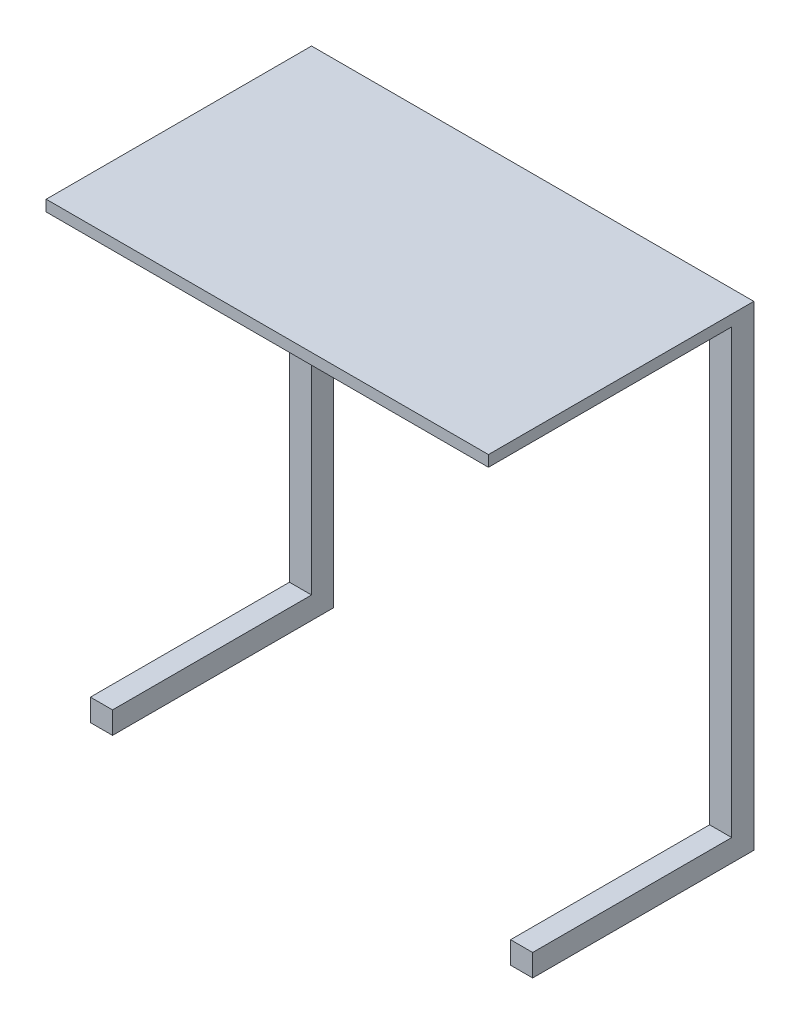
ISO-10303-21;
HEADER;
FILE_DESCRIPTION(('STEP AP214'),'2;1');
FILE_NAME('part.step','',(''),(''),'','','');
FILE_SCHEMA(('AUTOMOTIVE_DESIGN { 1 0 10303 214 1 1 1 1 }'));
ENDSEC;
DATA;
#1=APPLICATION_CONTEXT('core data for automotive mechanical design processes');
#2=APPLICATION_PROTOCOL_DEFINITION('international standard','automotive_design',2000,#1);
#3=PRODUCT_CONTEXT('',#1,'mechanical');
#4=PRODUCT('Part','Part','',(#3));
#5=PRODUCT_RELATED_PRODUCT_CATEGORY('part','',(#4));
#6=PRODUCT_DEFINITION_FORMATION('','',#4);
#7=PRODUCT_DEFINITION_CONTEXT('part definition',#1,'design');
#8=PRODUCT_DEFINITION('design','',#6,#7);
#9=PRODUCT_DEFINITION_SHAPE('','',#8);
#10=(LENGTH_UNIT() NAMED_UNIT(*) SI_UNIT(.MILLI.,.METRE.));
#11=(NAMED_UNIT(*) PLANE_ANGLE_UNIT() SI_UNIT($,.RADIAN.));
#12=(NAMED_UNIT(*) SI_UNIT($,.STERADIAN.) SOLID_ANGLE_UNIT());
#13=UNCERTAINTY_MEASURE_WITH_UNIT(LENGTH_MEASURE(1.E-05),#10,'distance_accuracy_value','');
#14=(GEOMETRIC_REPRESENTATION_CONTEXT(3) GLOBAL_UNCERTAINTY_ASSIGNED_CONTEXT((#13)) GLOBAL_UNIT_ASSIGNED_CONTEXT((#10,
#11,#12)) REPRESENTATION_CONTEXT('',''));
#15=CARTESIAN_POINT('',(0.,0.,0.));
#16=DIRECTION('',(0.,0.,1.));
#17=DIRECTION('',(1.,0.,0.));
#18=AXIS2_PLACEMENT_3D('',#15,#16,#17);
#19=CARTESIAN_POINT('',(508.,25.4,-304.8));
#20=DIRECTION('',(-1.,0.,0.));
#21=DIRECTION('',(0.,0.,1.));
#22=AXIS2_PLACEMENT_3D('',#19,#20,#21);
#23=PLANE('',#22);
#24=DIRECTION('',(0.,0.,-1.));
#25=VECTOR('',#24,1.);
#26=CARTESIAN_POINT('',(508.,0.,-304.8));
#27=LINE('',#26,#25);
#28=CARTESIAN_POINT('',(508.,0.,304.8));
#29=VERTEX_POINT('',#28);
#30=CARTESIAN_POINT('',(508.,0.,-254.));
#31=VERTEX_POINT('',#30);
#32=EDGE_CURVE('E209',#29,#31,#27,.T.);
#33=ORIENTED_EDGE('',*,*,#32,.T.);
#34=DIRECTION('',(0.,1.,0.));
#35=VECTOR('',#34,1.);
#36=CARTESIAN_POINT('',(508.,-1016.,-254.));
#37=LINE('',#36,#35);
#38=CARTESIAN_POINT('',(508.,-1016.,-254.));
#39=VERTEX_POINT('',#38);
#40=EDGE_CURVE('E192',#39,#31,#37,.T.);
#41=ORIENTED_EDGE('',*,*,#40,.F.);
#42=DIRECTION('',(0.,0.,1.));
#43=VECTOR('',#42,1.);
#44=CARTESIAN_POINT('',(508.,-1016.,-304.8));
#45=LINE('',#44,#43);
#46=CARTESIAN_POINT('',(508.,-1016.,203.2));
#47=VERTEX_POINT('',#46);
#48=EDGE_CURVE('E155',#39,#47,#45,.T.);
#49=ORIENTED_EDGE('',*,*,#48,.T.);
#50=DIRECTION('',(0.,1.,0.));
#51=VECTOR('',#50,1.);
#52=CARTESIAN_POINT('',(508.,-1066.8,203.2));
#53=LINE('',#52,#51);
#54=CARTESIAN_POINT('',(508.,-1066.8,203.2));
#55=VERTEX_POINT('',#54);
#56=EDGE_CURVE('E135',#55,#47,#53,.T.);
#57=ORIENTED_EDGE('',*,*,#56,.F.);
#58=DIRECTION('',(0.,0.,1.));
#59=VECTOR('',#58,1.);
#60=CARTESIAN_POINT('',(508.,-1066.8,-304.8));
#61=LINE('',#60,#59);
#62=CARTESIAN_POINT('',(508.,-1066.8,-304.8));
#63=VERTEX_POINT('',#62);
#64=EDGE_CURVE('E142',#63,#55,#61,.T.);
#65=ORIENTED_EDGE('',*,*,#64,.F.);
#66=DIRECTION('',(0.,-1.,0.));
#67=VECTOR('',#66,1.);
#68=CARTESIAN_POINT('',(508.,25.4,-304.8));
#69=LINE('',#68,#67);
#70=CARTESIAN_POINT('',(508.,25.4,-304.8));
#71=VERTEX_POINT('',#70);
#72=EDGE_CURVE('E11',#71,#63,#69,.T.);
#73=ORIENTED_EDGE('',*,*,#72,.F.);
#74=DIRECTION('',(0.,0.,-1.));
#75=VECTOR('',#74,1.);
#76=CARTESIAN_POINT('',(508.,25.4,-304.8));
#77=LINE('',#76,#75);
#78=CARTESIAN_POINT('',(508.,25.4,304.8));
#79=VERTEX_POINT('',#78);
#80=EDGE_CURVE('E213',#79,#71,#77,.T.);
#81=ORIENTED_EDGE('',*,*,#80,.F.);
#82=DIRECTION('',(0.,-1.,0.));
#83=VECTOR('',#82,1.);
#84=CARTESIAN_POINT('',(508.,25.4,304.8));
#85=LINE('',#84,#83);
#86=EDGE_CURVE('E223',#79,#29,#85,.T.);
#87=ORIENTED_EDGE('',*,*,#86,.T.);
#88=EDGE_LOOP('',(#33,#41,#49,#57,#65,#73,#81,#87));
#89=FACE_BOUND('',#88,.T.);
#90=ADVANCED_FACE('F32',(#89),#23,.F.);
#91=CARTESIAN_POINT('',(-508.,25.4,-304.8));
#92=DIRECTION('',(0.,0.,1.));
#93=DIRECTION('',(1.,0.,0.));
#94=AXIS2_PLACEMENT_3D('',#91,#92,#93);
#95=PLANE('',#94);
#96=ORIENTED_EDGE('',*,*,#72,.T.);
#97=DIRECTION('',(1.,0.,0.));
#98=VECTOR('',#97,1.);
#99=CARTESIAN_POINT('',(508.,-1066.8,-304.8));
#100=LINE('',#99,#98);
#101=CARTESIAN_POINT('',(457.2,-1066.8,-304.8));
#102=VERTEX_POINT('',#101);
#103=EDGE_CURVE('E148',#102,#63,#100,.T.);
#104=ORIENTED_EDGE('',*,*,#103,.F.);
#105=DIRECTION('',(0.,1.,0.));
#106=VECTOR('',#105,1.);
#107=CARTESIAN_POINT('',(457.2,-1016.,-304.8));
#108=LINE('',#107,#106);
#109=CARTESIAN_POINT('',(457.2,0.,-304.8));
#110=VERTEX_POINT('',#109);
#111=EDGE_CURVE('E187',#102,#110,#108,.T.);
#112=ORIENTED_EDGE('',*,*,#111,.T.);
#113=DIRECTION('',(-1.,0.,0.));
#114=VECTOR('',#113,1.);
#115=CARTESIAN_POINT('',(-508.,0.,-304.8));
#116=LINE('',#115,#114);
#117=CARTESIAN_POINT('',(-457.2,0.,-304.8));
#118=VERTEX_POINT('',#117);
#119=EDGE_CURVE('E53',#110,#118,#116,.T.);
#120=ORIENTED_EDGE('',*,*,#119,.T.);
#121=DIRECTION('',(0.,1.,0.));
#122=VECTOR('',#121,1.);
#123=CARTESIAN_POINT('',(-457.2,-1016.,-304.8));
#124=LINE('',#123,#122);
#125=CARTESIAN_POINT('',(-457.2,-1066.8,-304.8));
#126=VERTEX_POINT('',#125);
#127=EDGE_CURVE('E207',#126,#118,#124,.T.);
#128=ORIENTED_EDGE('',*,*,#127,.F.);
#129=DIRECTION('',(1.,0.,0.));
#130=VECTOR('',#129,1.);
#131=CARTESIAN_POINT('',(-508.,-1066.8,-304.8));
#132=LINE('',#131,#130);
#133=CARTESIAN_POINT('',(-508.,-1066.8,-304.8));
#134=VERTEX_POINT('',#133);
#135=EDGE_CURVE('E168',#134,#126,#132,.T.);
#136=ORIENTED_EDGE('',*,*,#135,.F.);
#137=DIRECTION('',(0.,-1.,0.));
#138=VECTOR('',#137,1.);
#139=CARTESIAN_POINT('',(-508.,25.4,-304.8));
#140=LINE('',#139,#138);
#141=CARTESIAN_POINT('',(-508.,25.4,-304.8));
#142=VERTEX_POINT('',#141);
#143=EDGE_CURVE('E39',#142,#134,#140,.T.);
#144=ORIENTED_EDGE('',*,*,#143,.F.);
#145=DIRECTION('',(-1.,0.,0.));
#146=VECTOR('',#145,1.);
#147=CARTESIAN_POINT('',(-508.,25.4,-304.8));
#148=LINE('',#147,#146);
#149=EDGE_CURVE('E216',#71,#142,#148,.T.);
#150=ORIENTED_EDGE('',*,*,#149,.F.);
#151=EDGE_LOOP('',(#96,#104,#112,#120,#128,#136,#144,#150));
#152=FACE_BOUND('',#151,.T.);
#153=ADVANCED_FACE('F240',(#152),#95,.F.);
#154=CARTESIAN_POINT('',(-508.,25.4,-304.8));
#155=DIRECTION('',(1.,0.,0.));
#156=DIRECTION('',(0.,0.,-1.));
#157=AXIS2_PLACEMENT_3D('',#154,#155,#156);
#158=PLANE('',#157);
#159=ORIENTED_EDGE('',*,*,#143,.T.);
#160=DIRECTION('',(0.,0.,-1.));
#161=VECTOR('',#160,1.);
#162=CARTESIAN_POINT('',(-508.,-1066.8,-304.8));
#163=LINE('',#162,#161);
#164=CARTESIAN_POINT('',(-508.,-1066.8,203.2));
#165=VERTEX_POINT('',#164);
#166=EDGE_CURVE('E165',#165,#134,#163,.T.);
#167=ORIENTED_EDGE('',*,*,#166,.F.);
#168=DIRECTION('',(0.,1.,0.));
#169=VECTOR('',#168,1.);
#170=CARTESIAN_POINT('',(-508.,-1066.8,203.2));
#171=LINE('',#170,#169);
#172=CARTESIAN_POINT('',(-508.,-1016.,203.2));
#173=VERTEX_POINT('',#172);
#174=EDGE_CURVE('E175',#165,#173,#171,.T.);
#175=ORIENTED_EDGE('',*,*,#174,.T.);
#176=DIRECTION('',(0.,0.,-1.));
#177=VECTOR('',#176,1.);
#178=CARTESIAN_POINT('',(-508.,-1016.,-304.8));
#179=LINE('',#178,#177);
#180=CARTESIAN_POINT('',(-508.,-1016.,-254.));
#181=VERTEX_POINT('',#180);
#182=EDGE_CURVE('E157',#173,#181,#179,.T.);
#183=ORIENTED_EDGE('',*,*,#182,.T.);
#184=DIRECTION('',(0.,1.,0.));
#185=VECTOR('',#184,1.);
#186=CARTESIAN_POINT('',(-508.,-1016.,-254.));
#187=LINE('',#186,#185);
#188=CARTESIAN_POINT('',(-508.,0.,-254.));
#189=VERTEX_POINT('',#188);
#190=EDGE_CURVE('E201',#181,#189,#187,.T.);
#191=ORIENTED_EDGE('',*,*,#190,.T.);
#192=DIRECTION('',(0.,0.,1.));
#193=VECTOR('',#192,1.);
#194=CARTESIAN_POINT('',(-508.,0.,-304.8));
#195=LINE('',#194,#193);
#196=CARTESIAN_POINT('',(-508.,0.,304.8));
#197=VERTEX_POINT('',#196);
#198=EDGE_CURVE('E226',#189,#197,#195,.T.);
#199=ORIENTED_EDGE('',*,*,#198,.T.);
#200=DIRECTION('',(0.,-1.,0.));
#201=VECTOR('',#200,1.);
#202=CARTESIAN_POINT('',(-508.,25.4,304.8));
#203=LINE('',#202,#201);
#204=CARTESIAN_POINT('',(-508.,25.4,304.8));
#205=VERTEX_POINT('',#204);
#206=EDGE_CURVE('E231',#205,#197,#203,.T.);
#207=ORIENTED_EDGE('',*,*,#206,.F.);
#208=DIRECTION('',(0.,0.,1.));
#209=VECTOR('',#208,1.);
#210=CARTESIAN_POINT('',(-508.,25.4,-304.8));
#211=LINE('',#210,#209);
#212=EDGE_CURVE('E219',#142,#205,#211,.T.);
#213=ORIENTED_EDGE('',*,*,#212,.F.);
#214=EDGE_LOOP('',(#159,#167,#175,#183,#191,#199,#207,#213));
#215=FACE_BOUND('',#214,.T.);
#216=ADVANCED_FACE('F238',(#215),#158,.F.);
#217=CARTESIAN_POINT('',(-508.,25.4,304.8));
#218=DIRECTION('',(0.,0.,-1.));
#219=DIRECTION('',(-1.,0.,0.));
#220=AXIS2_PLACEMENT_3D('',#217,#218,#219);
#221=PLANE('',#220);
#222=DIRECTION('',(1.,0.,0.));
#223=VECTOR('',#222,1.);
#224=CARTESIAN_POINT('',(-508.,0.,304.8));
#225=LINE('',#224,#223);
#226=EDGE_CURVE('E217',#197,#29,#225,.T.);
#227=ORIENTED_EDGE('',*,*,#226,.T.);
#228=ORIENTED_EDGE('',*,*,#86,.F.);
#229=DIRECTION('',(1.,0.,0.));
#230=VECTOR('',#229,1.);
#231=CARTESIAN_POINT('',(-508.,25.4,304.8));
#232=LINE('',#231,#230);
#233=EDGE_CURVE('E221',#205,#79,#232,.T.);
#234=ORIENTED_EDGE('',*,*,#233,.F.);
#235=ORIENTED_EDGE('',*,*,#206,.T.);
#236=EDGE_LOOP('',(#227,#228,#234,#235));
#237=FACE_BOUND('',#236,.T.);
#238=ADVANCED_FACE('F264',(#237),#221,.F.);
#239=CARTESIAN_POINT('',(0.,25.4,0.));
#240=DIRECTION('',(0.,1.,0.));
#241=DIRECTION('',(0.,0.,1.));
#242=AXIS2_PLACEMENT_3D('',#239,#240,#241);
#243=PLANE('',#242);
#244=ORIENTED_EDGE('',*,*,#80,.T.);
#245=ORIENTED_EDGE('',*,*,#149,.T.);
#246=ORIENTED_EDGE('',*,*,#212,.T.);
#247=ORIENTED_EDGE('',*,*,#233,.T.);
#248=EDGE_LOOP('',(#244,#245,#246,#247));
#249=FACE_BOUND('',#248,.T.);
#250=ADVANCED_FACE('F271',(#249),#243,.T.);
#251=CARTESIAN_POINT('',(0.,0.,0.));
#252=DIRECTION('',(0.,1.,0.));
#253=DIRECTION('',(0.,0.,1.));
#254=AXIS2_PLACEMENT_3D('',#251,#252,#253);
#255=PLANE('',#254);
#256=DIRECTION('',(0.,0.,1.));
#257=VECTOR('',#256,1.);
#258=CARTESIAN_POINT('',(457.2,0.,-304.8));
#259=LINE('',#258,#257);
#260=CARTESIAN_POINT('',(457.2,0.,-254.));
#261=VERTEX_POINT('',#260);
#262=EDGE_CURVE('E46',#110,#261,#259,.T.);
#263=ORIENTED_EDGE('',*,*,#262,.T.);
#264=DIRECTION('',(1.,0.,0.));
#265=VECTOR('',#264,1.);
#266=CARTESIAN_POINT('',(508.,0.,-254.));
#267=LINE('',#266,#265);
#268=EDGE_CURVE('E188',#261,#31,#267,.T.);
#269=ORIENTED_EDGE('',*,*,#268,.T.);
#270=ORIENTED_EDGE('',*,*,#32,.F.);
#271=ORIENTED_EDGE('',*,*,#226,.F.);
#272=ORIENTED_EDGE('',*,*,#198,.F.);
#273=DIRECTION('',(1.,0.,0.));
#274=VECTOR('',#273,1.);
#275=CARTESIAN_POINT('',(-508.,0.,-254.));
#276=LINE('',#275,#274);
#277=CARTESIAN_POINT('',(-457.2,0.,-254.));
#278=VERTEX_POINT('',#277);
#279=EDGE_CURVE('E194',#189,#278,#276,.T.);
#280=ORIENTED_EDGE('',*,*,#279,.T.);
#281=DIRECTION('',(0.,0.,-1.));
#282=VECTOR('',#281,1.);
#283=CARTESIAN_POINT('',(-457.2,0.,-304.8));
#284=LINE('',#283,#282);
#285=EDGE_CURVE('E202',#278,#118,#284,.T.);
#286=ORIENTED_EDGE('',*,*,#285,.T.);
#287=ORIENTED_EDGE('',*,*,#119,.F.);
#288=EDGE_LOOP('',(#263,#269,#270,#271,#272,#280,#286,#287));
#289=FACE_BOUND('',#288,.T.);
#290=ADVANCED_FACE('F267',(#289),#255,.F.);
#291=CARTESIAN_POINT('',(-457.2,-1016.,-304.8));
#292=DIRECTION('',(1.,0.,0.));
#293=DIRECTION('',(0.,0.,-1.));
#294=AXIS2_PLACEMENT_3D('',#291,#292,#293);
#295=PLANE('',#294);
#296=ORIENTED_EDGE('',*,*,#285,.F.);
#297=DIRECTION('',(0.,1.,0.));
#298=VECTOR('',#297,1.);
#299=CARTESIAN_POINT('',(-457.2,-1016.,-254.));
#300=LINE('',#299,#298);
#301=CARTESIAN_POINT('',(-457.2,-1016.,-254.));
#302=VERTEX_POINT('',#301);
#303=EDGE_CURVE('E210',#302,#278,#300,.T.);
#304=ORIENTED_EDGE('',*,*,#303,.F.);
#305=DIRECTION('',(0.,0.,1.));
#306=VECTOR('',#305,1.);
#307=CARTESIAN_POINT('',(-457.2,-1016.,-304.8));
#308=LINE('',#307,#306);
#309=CARTESIAN_POINT('',(-457.2,-1016.,203.2));
#310=VERTEX_POINT('',#309);
#311=EDGE_CURVE('E160',#302,#310,#308,.T.);
#312=ORIENTED_EDGE('',*,*,#311,.T.);
#313=DIRECTION('',(0.,1.,0.));
#314=VECTOR('',#313,1.);
#315=CARTESIAN_POINT('',(-457.2,-1066.8,203.2));
#316=LINE('',#315,#314);
#317=CARTESIAN_POINT('',(-457.2,-1066.8,203.2));
#318=VERTEX_POINT('',#317);
#319=EDGE_CURVE('E181',#318,#310,#316,.T.);
#320=ORIENTED_EDGE('',*,*,#319,.F.);
#321=DIRECTION('',(0.,0.,1.));
#322=VECTOR('',#321,1.);
#323=CARTESIAN_POINT('',(-457.2,-1066.8,-304.8));
#324=LINE('',#323,#322);
#325=EDGE_CURVE('E172',#126,#318,#324,.T.);
#326=ORIENTED_EDGE('',*,*,#325,.F.);
#327=ORIENTED_EDGE('',*,*,#127,.T.);
#328=EDGE_LOOP('',(#296,#304,#312,#320,#326,#327));
#329=FACE_BOUND('',#328,.T.);
#330=ADVANCED_FACE('F285',(#329),#295,.T.);
#331=CARTESIAN_POINT('',(-508.,-1016.,-254.));
#332=DIRECTION('',(0.,0.,1.));
#333=DIRECTION('',(1.,0.,0.));
#334=AXIS2_PLACEMENT_3D('',#331,#332,#333);
#335=PLANE('',#334);
#336=ORIENTED_EDGE('',*,*,#279,.F.);
#337=ORIENTED_EDGE('',*,*,#190,.F.);
#338=DIRECTION('',(1.,0.,0.));
#339=VECTOR('',#338,1.);
#340=CARTESIAN_POINT('',(-508.,-1016.,-254.));
#341=LINE('',#340,#339);
#342=EDGE_CURVE('E198',#181,#302,#341,.T.);
#343=ORIENTED_EDGE('',*,*,#342,.T.);
#344=ORIENTED_EDGE('',*,*,#303,.T.);
#345=EDGE_LOOP('',(#336,#337,#343,#344));
#346=FACE_BOUND('',#345,.T.);
#347=ADVANCED_FACE('F257',(#346),#335,.T.);
#348=CARTESIAN_POINT('',(508.,-1016.,-254.));
#349=DIRECTION('',(0.,0.,1.));
#350=DIRECTION('',(1.,0.,0.));
#351=AXIS2_PLACEMENT_3D('',#348,#349,#350);
#352=PLANE('',#351);
#353=ORIENTED_EDGE('',*,*,#268,.F.);
#354=DIRECTION('',(0.,1.,0.));
#355=VECTOR('',#354,1.);
#356=CARTESIAN_POINT('',(457.2,-1016.,-254.));
#357=LINE('',#356,#355);
#358=CARTESIAN_POINT('',(457.2,-1016.,-254.));
#359=VERTEX_POINT('',#358);
#360=EDGE_CURVE('E195',#359,#261,#357,.T.);
#361=ORIENTED_EDGE('',*,*,#360,.F.);
#362=DIRECTION('',(1.,0.,0.));
#363=VECTOR('',#362,1.);
#364=CARTESIAN_POINT('',(508.,-1016.,-254.));
#365=LINE('',#364,#363);
#366=EDGE_CURVE('E184',#359,#39,#365,.T.);
#367=ORIENTED_EDGE('',*,*,#366,.T.);
#368=ORIENTED_EDGE('',*,*,#40,.T.);
#369=EDGE_LOOP('',(#353,#361,#367,#368));
#370=FACE_BOUND('',#369,.T.);
#371=ADVANCED_FACE('F283',(#370),#352,.T.);
#372=CARTESIAN_POINT('',(457.2,-1016.,-304.8));
#373=DIRECTION('',(-1.,0.,0.));
#374=DIRECTION('',(0.,0.,1.));
#375=AXIS2_PLACEMENT_3D('',#372,#373,#374);
#376=PLANE('',#375);
#377=ORIENTED_EDGE('',*,*,#262,.F.);
#378=ORIENTED_EDGE('',*,*,#111,.F.);
#379=DIRECTION('',(0.,0.,-1.));
#380=VECTOR('',#379,1.);
#381=CARTESIAN_POINT('',(457.2,-1066.8,-304.8));
#382=LINE('',#381,#380);
#383=CARTESIAN_POINT('',(457.2,-1066.8,203.2));
#384=VERTEX_POINT('',#383);
#385=EDGE_CURVE('E141',#384,#102,#382,.T.);
#386=ORIENTED_EDGE('',*,*,#385,.F.);
#387=DIRECTION('',(0.,1.,0.));
#388=VECTOR('',#387,1.);
#389=CARTESIAN_POINT('',(457.2,-1066.8,203.2));
#390=LINE('',#389,#388);
#391=CARTESIAN_POINT('',(457.2,-1016.,203.2));
#392=VERTEX_POINT('',#391);
#393=EDGE_CURVE('E137',#384,#392,#390,.T.);
#394=ORIENTED_EDGE('',*,*,#393,.T.);
#395=DIRECTION('',(0.,0.,-1.));
#396=VECTOR('',#395,1.);
#397=CARTESIAN_POINT('',(457.2,-1016.,-304.8));
#398=LINE('',#397,#396);
#399=EDGE_CURVE('E151',#392,#359,#398,.T.);
#400=ORIENTED_EDGE('',*,*,#399,.T.);
#401=ORIENTED_EDGE('',*,*,#360,.T.);
#402=EDGE_LOOP('',(#377,#378,#386,#394,#400,#401));
#403=FACE_BOUND('',#402,.T.);
#404=ADVANCED_FACE('F280',(#403),#376,.T.);
#405=CARTESIAN_POINT('',(-508.,-1066.8,203.2));
#406=DIRECTION('',(0.,0.,-1.));
#407=DIRECTION('',(-1.,0.,0.));
#408=AXIS2_PLACEMENT_3D('',#405,#406,#407);
#409=PLANE('',#408);
#410=DIRECTION('',(-1.,0.,0.));
#411=VECTOR('',#410,1.);
#412=CARTESIAN_POINT('',(-508.,-1016.,203.2));
#413=LINE('',#412,#411);
#414=EDGE_CURVE('E169',#310,#173,#413,.T.);
#415=ORIENTED_EDGE('',*,*,#414,.T.);
#416=ORIENTED_EDGE('',*,*,#174,.F.);
#417=DIRECTION('',(-1.,0.,0.));
#418=VECTOR('',#417,1.);
#419=CARTESIAN_POINT('',(-508.,-1066.8,203.2));
#420=LINE('',#419,#418);
#421=EDGE_CURVE('E174',#318,#165,#420,.T.);
#422=ORIENTED_EDGE('',*,*,#421,.F.);
#423=ORIENTED_EDGE('',*,*,#319,.T.);
#424=EDGE_LOOP('',(#415,#416,#422,#423));
#425=FACE_BOUND('',#424,.T.);
#426=ADVANCED_FACE('F248',(#425),#409,.F.);
#427=CARTESIAN_POINT('',(0.,-1066.8,0.));
#428=DIRECTION('',(0.,1.,0.));
#429=DIRECTION('',(0.,0.,1.));
#430=AXIS2_PLACEMENT_3D('',#427,#428,#429);
#431=PLANE('',#430);
#432=ORIENTED_EDGE('',*,*,#166,.T.);
#433=ORIENTED_EDGE('',*,*,#135,.T.);
#434=ORIENTED_EDGE('',*,*,#325,.T.);
#435=ORIENTED_EDGE('',*,*,#421,.T.);
#436=EDGE_LOOP('',(#432,#433,#434,#435));
#437=FACE_BOUND('',#436,.T.);
#438=ADVANCED_FACE('F243',(#437),#431,.F.);
#439=CARTESIAN_POINT('',(0.,-1016.,0.));
#440=DIRECTION('',(0.,1.,0.));
#441=DIRECTION('',(0.,0.,1.));
#442=AXIS2_PLACEMENT_3D('',#439,#440,#441);
#443=PLANE('',#442);
#444=ORIENTED_EDGE('',*,*,#311,.F.);
#445=ORIENTED_EDGE('',*,*,#342,.F.);
#446=ORIENTED_EDGE('',*,*,#182,.F.);
#447=ORIENTED_EDGE('',*,*,#414,.F.);
#448=EDGE_LOOP('',(#444,#445,#446,#447));
#449=FACE_BOUND('',#448,.T.);
#450=ADVANCED_FACE('F253',(#449),#443,.T.);
#451=CARTESIAN_POINT('',(508.,-1066.8,203.2));
#452=DIRECTION('',(0.,0.,-1.));
#453=DIRECTION('',(-1.,0.,0.));
#454=AXIS2_PLACEMENT_3D('',#451,#452,#453);
#455=PLANE('',#454);
#456=DIRECTION('',(-1.,0.,0.));
#457=VECTOR('',#456,1.);
#458=CARTESIAN_POINT('',(508.,-1016.,203.2));
#459=LINE('',#458,#457);
#460=EDGE_CURVE('E276',#47,#392,#459,.T.);
#461=ORIENTED_EDGE('',*,*,#460,.T.);
#462=ORIENTED_EDGE('',*,*,#393,.F.);
#463=DIRECTION('',(-1.,0.,0.));
#464=VECTOR('',#463,1.);
#465=CARTESIAN_POINT('',(508.,-1066.8,203.2));
#466=LINE('',#465,#464);
#467=EDGE_CURVE('E131',#55,#384,#466,.T.);
#468=ORIENTED_EDGE('',*,*,#467,.F.);
#469=ORIENTED_EDGE('',*,*,#56,.T.);
#470=EDGE_LOOP('',(#461,#462,#468,#469));
#471=FACE_BOUND('',#470,.T.);
#472=ADVANCED_FACE('F133',(#471),#455,.F.);
#473=CARTESIAN_POINT('',(0.,-1066.8,0.));
#474=DIRECTION('',(0.,-1.,0.));
#475=DIRECTION('',(0.,0.,-1.));
#476=AXIS2_PLACEMENT_3D('',#473,#474,#475);
#477=PLANE('',#476);
#478=ORIENTED_EDGE('',*,*,#64,.T.);
#479=ORIENTED_EDGE('',*,*,#467,.T.);
#480=ORIENTED_EDGE('',*,*,#385,.T.);
#481=ORIENTED_EDGE('',*,*,#103,.T.);
#482=EDGE_LOOP('',(#478,#479,#480,#481));
#483=FACE_BOUND('',#482,.T.);
#484=ADVANCED_FACE('F146',(#483),#477,.T.);
#485=CARTESIAN_POINT('',(0.,-1016.,0.));
#486=DIRECTION('',(0.,-1.,0.));
#487=DIRECTION('',(0.,0.,-1.));
#488=AXIS2_PLACEMENT_3D('',#485,#486,#487);
#489=PLANE('',#488);
#490=ORIENTED_EDGE('',*,*,#366,.F.);
#491=ORIENTED_EDGE('',*,*,#399,.F.);
#492=ORIENTED_EDGE('',*,*,#460,.F.);
#493=ORIENTED_EDGE('',*,*,#48,.F.);
#494=EDGE_LOOP('',(#490,#491,#492,#493));
#495=FACE_BOUND('',#494,.T.);
#496=ADVANCED_FACE('F400',(#495),#489,.F.);
#497=CLOSED_SHELL('',(#90,#153,#216,#238,#250,#290,#330,#347,#371,#404,#426,#438,#450,#472,#484,#496));
#498=MANIFOLD_SOLID_BREP('B2',#497);
#499=ADVANCED_BREP_SHAPE_REPRESENTATION('',(#18,#498),#14);
#500=SHAPE_DEFINITION_REPRESENTATION(#9,#499);
ENDSEC;
END-ISO-10303-21;
